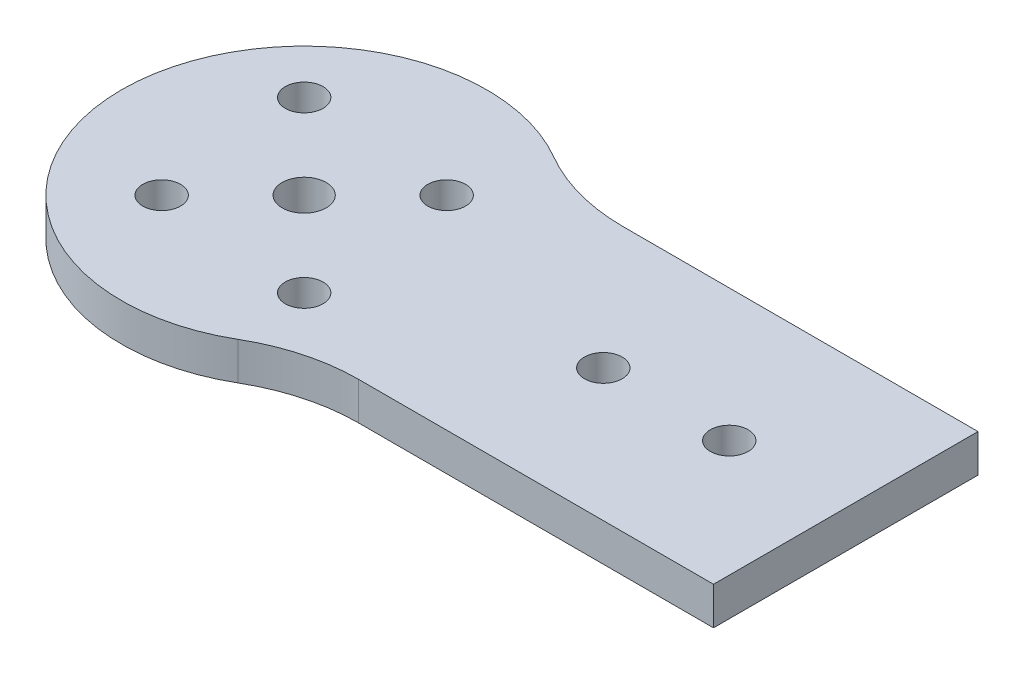
ISO-10303-21;
HEADER;
FILE_DESCRIPTION(('STEP AP214'),'2;1');
FILE_NAME('part.step','',(''),(''),'','','');
FILE_SCHEMA(('AUTOMOTIVE_DESIGN { 1 0 10303 214 1 1 1 1 }'));
ENDSEC;
DATA;
#1=APPLICATION_CONTEXT('core data for automotive mechanical design processes');
#2=APPLICATION_PROTOCOL_DEFINITION('international standard','automotive_design',2000,#1);
#3=PRODUCT_CONTEXT('',#1,'mechanical');
#4=PRODUCT('Part','Part','',(#3));
#5=PRODUCT_RELATED_PRODUCT_CATEGORY('part','',(#4));
#6=PRODUCT_DEFINITION_FORMATION('','',#4);
#7=PRODUCT_DEFINITION_CONTEXT('part definition',#1,'design');
#8=PRODUCT_DEFINITION('design','',#6,#7);
#9=PRODUCT_DEFINITION_SHAPE('','',#8);
#10=(LENGTH_UNIT() NAMED_UNIT(*) SI_UNIT(.MILLI.,.METRE.));
#11=(NAMED_UNIT(*) PLANE_ANGLE_UNIT() SI_UNIT($,.RADIAN.));
#12=(NAMED_UNIT(*) SI_UNIT($,.STERADIAN.) SOLID_ANGLE_UNIT());
#13=UNCERTAINTY_MEASURE_WITH_UNIT(LENGTH_MEASURE(1.E-05),#10,'distance_accuracy_value','');
#14=(GEOMETRIC_REPRESENTATION_CONTEXT(3) GLOBAL_UNCERTAINTY_ASSIGNED_CONTEXT((#13)) GLOBAL_UNIT_ASSIGNED_CONTEXT((#10,
#11,#12)) REPRESENTATION_CONTEXT('',''));
#15=CARTESIAN_POINT('',(0.,0.,0.));
#16=DIRECTION('',(0.,0.,1.));
#17=DIRECTION('',(1.,0.,0.));
#18=AXIS2_PLACEMENT_3D('',#15,#16,#17);
#19=CARTESIAN_POINT('',(0.,3.,0.));
#20=DIRECTION('',(0.,-1.,0.));
#21=DIRECTION('',(0.,0.,-1.));
#22=AXIS2_PLACEMENT_3D('',#19,#20,#21);
#23=CYLINDRICAL_SURFACE('',#22,14.5);
#24=CARTESIAN_POINT('',(0.,3.,0.));
#25=DIRECTION('',(0.,1.,0.));
#26=DIRECTION('',(0.,0.,1.));
#27=AXIS2_PLACEMENT_3D('',#24,#25,#26);
#28=CIRCLE('',#27,14.5);
#29=CARTESIAN_POINT('',(7.29050020765336,3.,-12.5338983050847));
#30=VERTEX_POINT('',#29);
#31=CARTESIAN_POINT('',(7.29050020765336,3.,12.5338983050847));
#32=VERTEX_POINT('',#31);
#33=EDGE_CURVE('E102',#30,#32,#28,.T.);
#34=ORIENTED_EDGE('',*,*,#33,.F.);
#35=DIRECTION('',(0.,-1.,0.));
#36=VECTOR('',#35,1.);
#37=CARTESIAN_POINT('',(7.29050020765336,3.,-12.5338983050847));
#38=LINE('',#37,#36);
#39=CARTESIAN_POINT('',(7.29050020765336,0.,-12.5338983050847));
#40=VERTEX_POINT('',#39);
#41=EDGE_CURVE('E146',#30,#40,#38,.T.);
#42=ORIENTED_EDGE('',*,*,#41,.T.);
#43=CARTESIAN_POINT('',(0.,0.,0.));
#44=DIRECTION('',(0.,1.,0.));
#45=DIRECTION('',(0.,0.,1.));
#46=AXIS2_PLACEMENT_3D('',#43,#44,#45);
#47=CIRCLE('',#46,14.5);
#48=CARTESIAN_POINT('',(7.29050020765336,0.,12.5338983050847));
#49=VERTEX_POINT('',#48);
#50=EDGE_CURVE('E136',#40,#49,#47,.T.);
#51=ORIENTED_EDGE('',*,*,#50,.T.);
#52=DIRECTION('',(0.,-1.,0.));
#53=VECTOR('',#52,1.);
#54=CARTESIAN_POINT('',(7.29050020765336,3.,12.5338983050847));
#55=LINE('',#54,#53);
#56=EDGE_CURVE('E111',#49,#32,#55,.F.);
#57=ORIENTED_EDGE('',*,*,#56,.T.);
#58=EDGE_LOOP('',(#34,#42,#51,#57));
#59=FACE_BOUND('',#58,.T.);
#60=ADVANCED_FACE('F44',(#59),#23,.T.);
#61=CARTESIAN_POINT('',(0.,3.,10.5));
#62=DIRECTION('',(0.,0.,-1.));
#63=DIRECTION('',(-1.,0.,0.));
#64=AXIS2_PLACEMENT_3D('',#61,#62,#63);
#65=PLANE('',#64);
#66=DIRECTION('',(1.,0.,0.));
#67=VECTOR('',#66,1.);
#68=CARTESIAN_POINT('',(0.,3.,10.5));
#69=LINE('',#68,#67);
#70=CARTESIAN_POINT('',(14.8323969741913,3.,10.5));
#71=VERTEX_POINT('',#70);
#72=CARTESIAN_POINT('',(43.,3.,10.5));
#73=VERTEX_POINT('',#72);
#74=EDGE_CURVE('E96',#71,#73,#69,.T.);
#75=ORIENTED_EDGE('',*,*,#74,.F.);
#76=DIRECTION('',(0.,1.,0.));
#77=VECTOR('',#76,1.);
#78=CARTESIAN_POINT('',(14.8323969741913,0.,10.5));
#79=LINE('',#78,#77);
#80=CARTESIAN_POINT('',(14.8323969741913,0.,10.5));
#81=VERTEX_POINT('',#80);
#82=EDGE_CURVE('E153',#71,#81,#79,.F.);
#83=ORIENTED_EDGE('',*,*,#82,.T.);
#84=DIRECTION('',(1.,0.,0.));
#85=VECTOR('',#84,1.);
#86=CARTESIAN_POINT('',(0.,0.,10.5));
#87=LINE('',#86,#85);
#88=CARTESIAN_POINT('',(43.,0.,10.5));
#89=VERTEX_POINT('',#88);
#90=EDGE_CURVE('E109',#81,#89,#87,.T.);
#91=ORIENTED_EDGE('',*,*,#90,.T.);
#92=DIRECTION('',(0.,-1.,0.));
#93=VECTOR('',#92,1.);
#94=CARTESIAN_POINT('',(43.,3.,10.5));
#95=LINE('',#94,#93);
#96=EDGE_CURVE('E110',#73,#89,#95,.T.);
#97=ORIENTED_EDGE('',*,*,#96,.F.);
#98=EDGE_LOOP('',(#75,#83,#91,#97));
#99=FACE_BOUND('',#98,.T.);
#100=ADVANCED_FACE('F107',(#99),#65,.F.);
#101=CARTESIAN_POINT('',(43.,3.,0.));
#102=DIRECTION('',(-1.,0.,0.));
#103=DIRECTION('',(0.,0.,1.));
#104=AXIS2_PLACEMENT_3D('',#101,#102,#103);
#105=PLANE('',#104);
#106=DIRECTION('',(0.,0.,-1.));
#107=VECTOR('',#106,1.);
#108=CARTESIAN_POINT('',(43.,0.,0.));
#109=LINE('',#108,#107);
#110=CARTESIAN_POINT('',(43.,0.,-10.5));
#111=VERTEX_POINT('',#110);
#112=EDGE_CURVE('E143',#89,#111,#109,.T.);
#113=ORIENTED_EDGE('',*,*,#112,.T.);
#114=DIRECTION('',(0.,-1.,0.));
#115=VECTOR('',#114,1.);
#116=CARTESIAN_POINT('',(43.,3.,-10.5));
#117=LINE('',#116,#115);
#118=CARTESIAN_POINT('',(43.,3.,-10.5));
#119=VERTEX_POINT('',#118);
#120=EDGE_CURVE('E113',#119,#111,#117,.T.);
#121=ORIENTED_EDGE('',*,*,#120,.F.);
#122=DIRECTION('',(0.,0.,-1.));
#123=VECTOR('',#122,1.);
#124=CARTESIAN_POINT('',(43.,3.,0.));
#125=LINE('',#124,#123);
#126=EDGE_CURVE('E101',#73,#119,#125,.T.);
#127=ORIENTED_EDGE('',*,*,#126,.F.);
#128=ORIENTED_EDGE('',*,*,#96,.T.);
#129=EDGE_LOOP('',(#113,#121,#127,#128));
#130=FACE_BOUND('',#129,.T.);
#131=ADVANCED_FACE('F117',(#130),#105,.F.);
#132=CARTESIAN_POINT('',(5.65685424949237,3.,-5.65685424949239));
#133=DIRECTION('',(0.,-1.,0.));
#134=DIRECTION('',(0.,0.,-1.));
#135=AXIS2_PLACEMENT_3D('',#132,#133,#134);
#136=CYLINDRICAL_SURFACE('',#135,1.5);
#137=CARTESIAN_POINT('',(5.65685424949237,3.,-5.65685424949239));
#138=DIRECTION('',(0.,1.,0.));
#139=DIRECTION('',(0.,0.,1.));
#140=AXIS2_PLACEMENT_3D('',#137,#138,#139);
#141=CIRCLE('',#140,1.5);
#142=CARTESIAN_POINT('',(5.65685424949237,3.,-4.15685424949239));
#143=VERTEX_POINT('',#142);
#144=EDGE_CURVE('E339',#143,#143,#141,.T.);
#145=ORIENTED_EDGE('',*,*,#144,.T.);
#146=EDGE_LOOP('',(#145));
#147=FACE_BOUND('',#146,.T.);
#148=CARTESIAN_POINT('',(5.65685424949237,0.,-5.65685424949239));
#149=DIRECTION('',(0.,1.,0.));
#150=DIRECTION('',(0.,0.,1.));
#151=AXIS2_PLACEMENT_3D('',#148,#149,#150);
#152=CIRCLE('',#151,1.5);
#153=CARTESIAN_POINT('',(5.65685424949237,0.,-4.15685424949239));
#154=VERTEX_POINT('',#153);
#155=EDGE_CURVE('E133',#154,#154,#152,.T.);
#156=ORIENTED_EDGE('',*,*,#155,.F.);
#157=EDGE_LOOP('',(#156));
#158=FACE_BOUND('',#157,.T.);
#159=ADVANCED_FACE('F183',(#147,#158),#136,.F.);
#160=CARTESIAN_POINT('',(-6.7175144212722,3.,-6.7175144212722));
#161=DIRECTION('',(0.,-1.,0.));
#162=DIRECTION('',(0.,0.,-1.));
#163=AXIS2_PLACEMENT_3D('',#160,#161,#162);
#164=CYLINDRICAL_SURFACE('',#163,1.5);
#165=CARTESIAN_POINT('',(-6.7175144212722,3.,-6.7175144212722));
#166=DIRECTION('',(0.,1.,0.));
#167=DIRECTION('',(0.,0.,1.));
#168=AXIS2_PLACEMENT_3D('',#165,#166,#167);
#169=CIRCLE('',#168,1.5);
#170=CARTESIAN_POINT('',(-6.7175144212722,3.,-5.2175144212722));
#171=VERTEX_POINT('',#170);
#172=EDGE_CURVE('E333',#171,#171,#169,.T.);
#173=ORIENTED_EDGE('',*,*,#172,.T.);
#174=EDGE_LOOP('',(#173));
#175=FACE_BOUND('',#174,.T.);
#176=CARTESIAN_POINT('',(-6.7175144212722,0.,-6.7175144212722));
#177=DIRECTION('',(0.,1.,0.));
#178=DIRECTION('',(0.,0.,1.));
#179=AXIS2_PLACEMENT_3D('',#176,#177,#178);
#180=CIRCLE('',#179,1.5);
#181=CARTESIAN_POINT('',(-6.7175144212722,0.,-5.2175144212722));
#182=VERTEX_POINT('',#181);
#183=EDGE_CURVE('E131',#182,#182,#180,.T.);
#184=ORIENTED_EDGE('',*,*,#183,.F.);
#185=EDGE_LOOP('',(#184));
#186=FACE_BOUND('',#185,.T.);
#187=ADVANCED_FACE('F189',(#175,#186),#164,.F.);
#188=CARTESIAN_POINT('',(-5.65685424949238,3.,5.65685424949238));
#189=DIRECTION('',(0.,-1.,0.));
#190=DIRECTION('',(0.,0.,-1.));
#191=AXIS2_PLACEMENT_3D('',#188,#189,#190);
#192=CYLINDRICAL_SURFACE('',#191,1.5);
#193=CARTESIAN_POINT('',(-5.65685424949238,3.,5.65685424949238));
#194=DIRECTION('',(0.,1.,0.));
#195=DIRECTION('',(0.,0.,1.));
#196=AXIS2_PLACEMENT_3D('',#193,#194,#195);
#197=CIRCLE('',#196,1.5);
#198=CARTESIAN_POINT('',(-5.65685424949238,3.,7.15685424949238));
#199=VERTEX_POINT('',#198);
#200=EDGE_CURVE('E335',#199,#199,#197,.T.);
#201=ORIENTED_EDGE('',*,*,#200,.T.);
#202=EDGE_LOOP('',(#201));
#203=FACE_BOUND('',#202,.T.);
#204=CARTESIAN_POINT('',(-5.65685424949238,0.,5.65685424949238));
#205=DIRECTION('',(0.,1.,0.));
#206=DIRECTION('',(0.,0.,1.));
#207=AXIS2_PLACEMENT_3D('',#204,#205,#206);
#208=CIRCLE('',#207,1.5);
#209=CARTESIAN_POINT('',(-5.65685424949238,0.,7.15685424949238));
#210=VERTEX_POINT('',#209);
#211=EDGE_CURVE('E130',#210,#210,#208,.T.);
#212=ORIENTED_EDGE('',*,*,#211,.F.);
#213=EDGE_LOOP('',(#212));
#214=FACE_BOUND('',#213,.T.);
#215=ADVANCED_FACE('F191',(#203,#214),#192,.F.);
#216=CARTESIAN_POINT('',(6.7175144212722,3.,6.7175144212722));
#217=DIRECTION('',(0.,-1.,0.));
#218=DIRECTION('',(0.,0.,-1.));
#219=AXIS2_PLACEMENT_3D('',#216,#217,#218);
#220=CYLINDRICAL_SURFACE('',#219,1.5);
#221=CARTESIAN_POINT('',(6.7175144212722,3.,6.7175144212722));
#222=DIRECTION('',(0.,1.,0.));
#223=DIRECTION('',(0.,0.,1.));
#224=AXIS2_PLACEMENT_3D('',#221,#222,#223);
#225=CIRCLE('',#224,1.5);
#226=CARTESIAN_POINT('',(6.7175144212722,3.,8.2175144212722));
#227=VERTEX_POINT('',#226);
#228=EDGE_CURVE('E144',#227,#227,#225,.T.);
#229=ORIENTED_EDGE('',*,*,#228,.T.);
#230=EDGE_LOOP('',(#229));
#231=FACE_BOUND('',#230,.T.);
#232=CARTESIAN_POINT('',(6.7175144212722,0.,6.7175144212722));
#233=DIRECTION('',(0.,1.,0.));
#234=DIRECTION('',(0.,0.,1.));
#235=AXIS2_PLACEMENT_3D('',#232,#233,#234);
#236=CIRCLE('',#235,1.5);
#237=CARTESIAN_POINT('',(6.7175144212722,0.,8.2175144212722));
#238=VERTEX_POINT('',#237);
#239=EDGE_CURVE('E123',#238,#238,#236,.T.);
#240=ORIENTED_EDGE('',*,*,#239,.F.);
#241=EDGE_LOOP('',(#240));
#242=FACE_BOUND('',#241,.T.);
#243=ADVANCED_FACE('F198',(#231,#242),#220,.F.);
#244=CARTESIAN_POINT('',(0.,3.,-10.5));
#245=DIRECTION('',(0.,0.,-1.));
#246=DIRECTION('',(-1.,0.,0.));
#247=AXIS2_PLACEMENT_3D('',#244,#245,#246);
#248=PLANE('',#247);
#249=DIRECTION('',(1.,0.,0.));
#250=VECTOR('',#249,1.);
#251=CARTESIAN_POINT('',(0.,0.,-10.5));
#252=LINE('',#251,#250);
#253=CARTESIAN_POINT('',(14.8323969741913,0.,-10.5));
#254=VERTEX_POINT('',#253);
#255=EDGE_CURVE('E141',#254,#111,#252,.T.);
#256=ORIENTED_EDGE('',*,*,#255,.F.);
#257=DIRECTION('',(0.,-1.,0.));
#258=VECTOR('',#257,1.);
#259=CARTESIAN_POINT('',(14.8323969741913,3.,-10.5));
#260=LINE('',#259,#258);
#261=CARTESIAN_POINT('',(14.8323969741913,3.,-10.5));
#262=VERTEX_POINT('',#261);
#263=EDGE_CURVE('E151',#254,#262,#260,.F.);
#264=ORIENTED_EDGE('',*,*,#263,.T.);
#265=DIRECTION('',(1.,0.,0.));
#266=VECTOR('',#265,1.);
#267=CARTESIAN_POINT('',(0.,3.,-10.5));
#268=LINE('',#267,#266);
#269=EDGE_CURVE('E118',#262,#119,#268,.T.);
#270=ORIENTED_EDGE('',*,*,#269,.T.);
#271=ORIENTED_EDGE('',*,*,#120,.T.);
#272=EDGE_LOOP('',(#256,#264,#270,#271));
#273=FACE_BOUND('',#272,.T.);
#274=ADVANCED_FACE('F196',(#273),#248,.T.);
#275=CARTESIAN_POINT('',(0.,3.,0.));
#276=DIRECTION('',(0.,1.,0.));
#277=DIRECTION('',(0.,0.,1.));
#278=AXIS2_PLACEMENT_3D('',#275,#276,#277);
#279=PLANE('',#278);
#280=CARTESIAN_POINT('',(0.,3.,0.));
#281=DIRECTION('',(0.,1.,0.));
#282=DIRECTION('',(0.,0.,1.));
#283=AXIS2_PLACEMENT_3D('',#280,#281,#282);
#284=CIRCLE('',#283,1.75);
#285=CARTESIAN_POINT('',(0.,3.,1.75));
#286=VERTEX_POINT('',#285);
#287=EDGE_CURVE('E316',#286,#286,#284,.T.);
#288=ORIENTED_EDGE('',*,*,#287,.F.);
#289=EDGE_LOOP('',(#288));
#290=FACE_BOUND('',#289,.T.);
#291=CARTESIAN_POINT('',(23.75,3.,0.));
#292=DIRECTION('',(0.,1.,0.));
#293=DIRECTION('',(0.,0.,1.));
#294=AXIS2_PLACEMENT_3D('',#291,#292,#293);
#295=CIRCLE('',#294,1.5);
#296=CARTESIAN_POINT('',(23.75,3.,1.5));
#297=VERTEX_POINT('',#296);
#298=EDGE_CURVE('E326',#297,#297,#295,.T.);
#299=ORIENTED_EDGE('',*,*,#298,.F.);
#300=EDGE_LOOP('',(#299));
#301=FACE_BOUND('',#300,.T.);
#302=CARTESIAN_POINT('',(33.75,3.,0.));
#303=DIRECTION('',(0.,1.,0.));
#304=DIRECTION('',(0.,0.,1.));
#305=AXIS2_PLACEMENT_3D('',#302,#303,#304);
#306=CIRCLE('',#305,1.5);
#307=CARTESIAN_POINT('',(33.75,3.,1.5));
#308=VERTEX_POINT('',#307);
#309=EDGE_CURVE('E318',#308,#308,#306,.T.);
#310=ORIENTED_EDGE('',*,*,#309,.F.);
#311=EDGE_LOOP('',(#310));
#312=FACE_BOUND('',#311,.T.);
#313=ORIENTED_EDGE('',*,*,#228,.F.);
#314=EDGE_LOOP('',(#313));
#315=FACE_BOUND('',#314,.T.);
#316=ORIENTED_EDGE('',*,*,#200,.F.);
#317=EDGE_LOOP('',(#316));
#318=FACE_BOUND('',#317,.T.);
#319=ORIENTED_EDGE('',*,*,#172,.F.);
#320=EDGE_LOOP('',(#319));
#321=FACE_BOUND('',#320,.T.);
#322=ORIENTED_EDGE('',*,*,#144,.F.);
#323=EDGE_LOOP('',(#322));
#324=FACE_BOUND('',#323,.T.);
#325=ORIENTED_EDGE('',*,*,#269,.F.);
#326=CARTESIAN_POINT('',(14.8323969741913,3.,-25.5));
#327=DIRECTION('',(0.,1.,0.));
#328=DIRECTION('',(0.,0.,1.));
#329=AXIS2_PLACEMENT_3D('',#326,#327,#328);
#330=CIRCLE('',#329,15.);
#331=EDGE_CURVE('E160',#262,#30,#330,.F.);
#332=ORIENTED_EDGE('',*,*,#331,.T.);
#333=ORIENTED_EDGE('',*,*,#33,.T.);
#334=CARTESIAN_POINT('',(14.8323969741913,3.,25.5));
#335=DIRECTION('',(0.,1.,0.));
#336=DIRECTION('',(0.,0.,1.));
#337=AXIS2_PLACEMENT_3D('',#334,#335,#336);
#338=CIRCLE('',#337,15.);
#339=EDGE_CURVE('E11',#32,#71,#338,.F.);
#340=ORIENTED_EDGE('',*,*,#339,.T.);
#341=ORIENTED_EDGE('',*,*,#74,.T.);
#342=ORIENTED_EDGE('',*,*,#126,.T.);
#343=EDGE_LOOP('',(#325,#332,#333,#340,#341,#342));
#344=FACE_BOUND('',#343,.T.);
#345=ADVANCED_FACE('F97',(#290,#301,#312,#315,#318,#321,#324,#344),#279,.T.);
#346=CARTESIAN_POINT('',(0.,0.,0.));
#347=DIRECTION('',(0.,1.,0.));
#348=DIRECTION('',(0.,0.,1.));
#349=AXIS2_PLACEMENT_3D('',#346,#347,#348);
#350=PLANE('',#349);
#351=CARTESIAN_POINT('',(0.,0.,0.));
#352=DIRECTION('',(0.,1.,0.));
#353=DIRECTION('',(0.,0.,1.));
#354=AXIS2_PLACEMENT_3D('',#351,#352,#353);
#355=CIRCLE('',#354,1.75);
#356=CARTESIAN_POINT('',(0.,0.,1.75));
#357=VERTEX_POINT('',#356);
#358=EDGE_CURVE('E47',#357,#357,#355,.T.);
#359=ORIENTED_EDGE('',*,*,#358,.T.);
#360=EDGE_LOOP('',(#359));
#361=FACE_BOUND('',#360,.T.);
#362=CARTESIAN_POINT('',(23.75,0.,0.));
#363=DIRECTION('',(0.,1.,0.));
#364=DIRECTION('',(0.,0.,1.));
#365=AXIS2_PLACEMENT_3D('',#362,#363,#364);
#366=CIRCLE('',#365,1.5);
#367=CARTESIAN_POINT('',(23.75,0.,1.5));
#368=VERTEX_POINT('',#367);
#369=EDGE_CURVE('E126',#368,#368,#366,.T.);
#370=ORIENTED_EDGE('',*,*,#369,.T.);
#371=EDGE_LOOP('',(#370));
#372=FACE_BOUND('',#371,.T.);
#373=CARTESIAN_POINT('',(33.75,0.,0.));
#374=DIRECTION('',(0.,1.,0.));
#375=DIRECTION('',(0.,0.,1.));
#376=AXIS2_PLACEMENT_3D('',#373,#374,#375);
#377=CIRCLE('',#376,1.5);
#378=CARTESIAN_POINT('',(33.75,0.,1.5));
#379=VERTEX_POINT('',#378);
#380=EDGE_CURVE('E319',#379,#379,#377,.T.);
#381=ORIENTED_EDGE('',*,*,#380,.T.);
#382=EDGE_LOOP('',(#381));
#383=FACE_BOUND('',#382,.T.);
#384=ORIENTED_EDGE('',*,*,#239,.T.);
#385=EDGE_LOOP('',(#384));
#386=FACE_BOUND('',#385,.T.);
#387=ORIENTED_EDGE('',*,*,#211,.T.);
#388=EDGE_LOOP('',(#387));
#389=FACE_BOUND('',#388,.T.);
#390=ORIENTED_EDGE('',*,*,#183,.T.);
#391=EDGE_LOOP('',(#390));
#392=FACE_BOUND('',#391,.T.);
#393=ORIENTED_EDGE('',*,*,#155,.T.);
#394=EDGE_LOOP('',(#393));
#395=FACE_BOUND('',#394,.T.);
#396=ORIENTED_EDGE('',*,*,#50,.F.);
#397=CARTESIAN_POINT('',(14.8323969741913,0.,-25.5));
#398=DIRECTION('',(0.,1.,0.));
#399=DIRECTION('',(0.,0.,1.));
#400=AXIS2_PLACEMENT_3D('',#397,#398,#399);
#401=CIRCLE('',#400,15.);
#402=EDGE_CURVE('E154',#40,#254,#401,.T.);
#403=ORIENTED_EDGE('',*,*,#402,.T.);
#404=ORIENTED_EDGE('',*,*,#255,.T.);
#405=ORIENTED_EDGE('',*,*,#112,.F.);
#406=ORIENTED_EDGE('',*,*,#90,.F.);
#407=CARTESIAN_POINT('',(14.8323969741913,0.,25.5));
#408=DIRECTION('',(0.,1.,0.));
#409=DIRECTION('',(0.,0.,1.));
#410=AXIS2_PLACEMENT_3D('',#407,#408,#409);
#411=CIRCLE('',#410,15.);
#412=EDGE_CURVE('E53',#81,#49,#411,.T.);
#413=ORIENTED_EDGE('',*,*,#412,.T.);
#414=EDGE_LOOP('',(#396,#403,#404,#405,#406,#413));
#415=FACE_BOUND('',#414,.T.);
#416=ADVANCED_FACE('F161',(#361,#372,#383,#386,#389,#392,#395,#415),#350,.F.);
#417=CARTESIAN_POINT('',(14.8323969741913,3.,-25.5));
#418=DIRECTION('',(0.,-1.,0.));
#419=DIRECTION('',(0.,0.,-1.));
#420=AXIS2_PLACEMENT_3D('',#417,#418,#419);
#421=CYLINDRICAL_SURFACE('',#420,15.);
#422=ORIENTED_EDGE('',*,*,#331,.F.);
#423=ORIENTED_EDGE('',*,*,#263,.F.);
#424=ORIENTED_EDGE('',*,*,#402,.F.);
#425=ORIENTED_EDGE('',*,*,#41,.F.);
#426=EDGE_LOOP('',(#422,#423,#424,#425));
#427=FACE_BOUND('',#426,.T.);
#428=ADVANCED_FACE('F170',(#427),#421,.F.);
#429=CARTESIAN_POINT('',(14.8323969741913,3.,25.5));
#430=DIRECTION('',(0.,-1.,0.));
#431=DIRECTION('',(0.,0.,-1.));
#432=AXIS2_PLACEMENT_3D('',#429,#430,#431);
#433=CYLINDRICAL_SURFACE('',#432,15.);
#434=ORIENTED_EDGE('',*,*,#339,.F.);
#435=ORIENTED_EDGE('',*,*,#56,.F.);
#436=ORIENTED_EDGE('',*,*,#412,.F.);
#437=ORIENTED_EDGE('',*,*,#82,.F.);
#438=EDGE_LOOP('',(#434,#435,#436,#437));
#439=FACE_BOUND('',#438,.T.);
#440=ADVANCED_FACE('F50',(#439),#433,.F.);
#441=CARTESIAN_POINT('',(33.75,0.,0.));
#442=DIRECTION('',(0.,1.,0.));
#443=DIRECTION('',(0.,0.,1.));
#444=AXIS2_PLACEMENT_3D('',#441,#442,#443);
#445=CYLINDRICAL_SURFACE('',#444,1.5);
#446=ORIENTED_EDGE('',*,*,#380,.F.);
#447=EDGE_LOOP('',(#446));
#448=FACE_BOUND('',#447,.T.);
#449=ORIENTED_EDGE('',*,*,#309,.T.);
#450=EDGE_LOOP('',(#449));
#451=FACE_BOUND('',#450,.T.);
#452=ADVANCED_FACE('F167',(#448,#451),#445,.F.);
#453=CARTESIAN_POINT('',(23.75,0.,0.));
#454=DIRECTION('',(0.,1.,0.));
#455=DIRECTION('',(0.,0.,1.));
#456=AXIS2_PLACEMENT_3D('',#453,#454,#455);
#457=CYLINDRICAL_SURFACE('',#456,1.5);
#458=ORIENTED_EDGE('',*,*,#369,.F.);
#459=EDGE_LOOP('',(#458));
#460=FACE_BOUND('',#459,.T.);
#461=ORIENTED_EDGE('',*,*,#298,.T.);
#462=EDGE_LOOP('',(#461));
#463=FACE_BOUND('',#462,.T.);
#464=ADVANCED_FACE('F172',(#460,#463),#457,.F.);
#465=CARTESIAN_POINT('',(0.,-7.,0.));
#466=DIRECTION('',(0.,1.,0.));
#467=DIRECTION('',(0.,0.,1.));
#468=AXIS2_PLACEMENT_3D('',#465,#466,#467);
#469=CYLINDRICAL_SURFACE('',#468,1.75);
#470=ORIENTED_EDGE('',*,*,#287,.T.);
#471=EDGE_LOOP('',(#470));
#472=FACE_BOUND('',#471,.T.);
#473=ORIENTED_EDGE('',*,*,#358,.F.);
#474=EDGE_LOOP('',(#473));
#475=FACE_BOUND('',#474,.T.);
#476=ADVANCED_FACE('F304',(#472,#475),#469,.F.);
#477=CLOSED_SHELL('',(#60,#100,#131,#159,#187,#215,#243,#274,#345,#416,#428,#440,#452,#464,#476));
#478=MANIFOLD_SOLID_BREP('B2',#477);
#479=ADVANCED_BREP_SHAPE_REPRESENTATION('',(#18,#478),#14);
#480=SHAPE_DEFINITION_REPRESENTATION(#9,#479);
ENDSEC;
END-ISO-10303-21;
